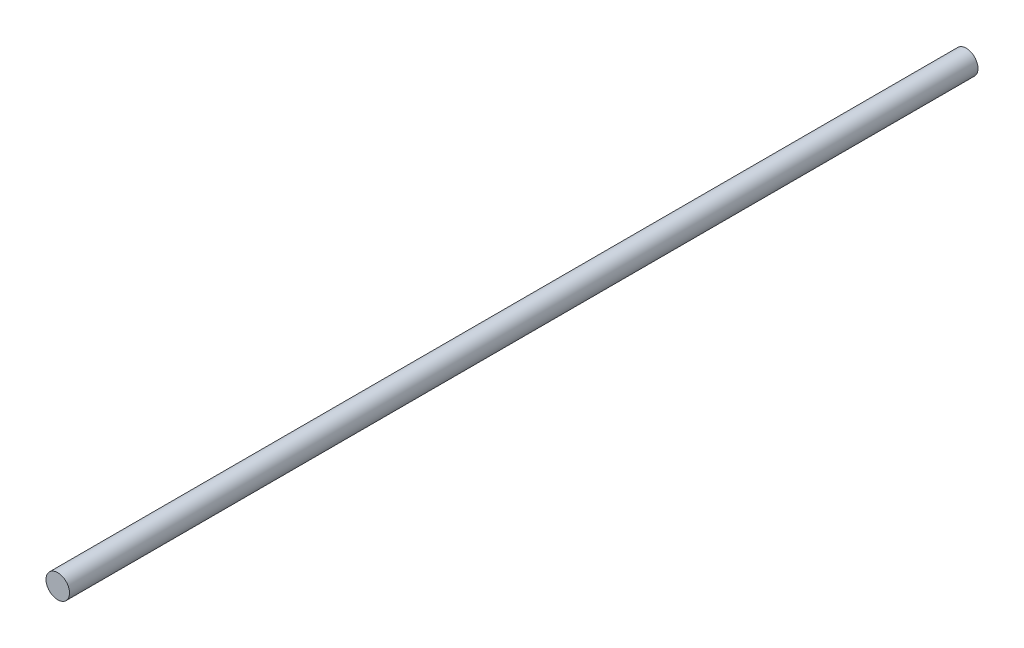
ISO-10303-21;
HEADER;
FILE_DESCRIPTION(('STEP AP214'),'2;1');
FILE_NAME('part.step','',(''),(''),'','','');
FILE_SCHEMA(('AUTOMOTIVE_DESIGN { 1 0 10303 214 1 1 1 1 }'));
ENDSEC;
DATA;
#1=APPLICATION_CONTEXT('core data for automotive mechanical design processes');
#2=APPLICATION_PROTOCOL_DEFINITION('international standard','automotive_design',2000,#1);
#3=PRODUCT_CONTEXT('',#1,'mechanical');
#4=PRODUCT('Part','Part','',(#3));
#5=PRODUCT_RELATED_PRODUCT_CATEGORY('part','',(#4));
#6=PRODUCT_DEFINITION_FORMATION('','',#4);
#7=PRODUCT_DEFINITION_CONTEXT('part definition',#1,'design');
#8=PRODUCT_DEFINITION('design','',#6,#7);
#9=PRODUCT_DEFINITION_SHAPE('','',#8);
#10=(LENGTH_UNIT() NAMED_UNIT(*) SI_UNIT(.MILLI.,.METRE.));
#11=(NAMED_UNIT(*) PLANE_ANGLE_UNIT() SI_UNIT($,.RADIAN.));
#12=(NAMED_UNIT(*) SI_UNIT($,.STERADIAN.) SOLID_ANGLE_UNIT());
#13=UNCERTAINTY_MEASURE_WITH_UNIT(LENGTH_MEASURE(1.E-05),#10,'distance_accuracy_value','');
#14=(GEOMETRIC_REPRESENTATION_CONTEXT(3) GLOBAL_UNCERTAINTY_ASSIGNED_CONTEXT((#13)) GLOBAL_UNIT_ASSIGNED_CONTEXT((#10,
#11,#12)) REPRESENTATION_CONTEXT('',''));
#15=CARTESIAN_POINT('',(0.,0.,0.));
#16=DIRECTION('',(0.,0.,1.));
#17=DIRECTION('',(1.,0.,0.));
#18=AXIS2_PLACEMENT_3D('',#15,#16,#17);
#19=CARTESIAN_POINT('',(0.,0.,245.));
#20=DIRECTION('',(0.,0.,-1.));
#21=DIRECTION('',(-1.,0.,0.));
#22=AXIS2_PLACEMENT_3D('',#19,#20,#21);
#23=CYLINDRICAL_SURFACE('',#22,3.175);
#24=CARTESIAN_POINT('',(0.,0.,245.));
#25=DIRECTION('',(0.,0.,1.));
#26=DIRECTION('',(1.,0.,0.));
#27=AXIS2_PLACEMENT_3D('',#24,#25,#26);
#28=CIRCLE('',#27,3.175);
#29=CARTESIAN_POINT('',(3.175,0.,245.));
#30=VERTEX_POINT('',#29);
#31=EDGE_CURVE('E10',#30,#30,#28,.T.);
#32=ORIENTED_EDGE('',*,*,#31,.F.);
#33=EDGE_LOOP('',(#32));
#34=FACE_BOUND('',#33,.T.);
#35=CARTESIAN_POINT('',(0.,0.,0.));
#36=DIRECTION('',(0.,0.,1.));
#37=DIRECTION('',(1.,0.,0.));
#38=AXIS2_PLACEMENT_3D('',#35,#36,#37);
#39=CIRCLE('',#38,3.175);
#40=CARTESIAN_POINT('',(3.175,0.,0.));
#41=VERTEX_POINT('',#40);
#42=EDGE_CURVE('E35',#41,#41,#39,.T.);
#43=ORIENTED_EDGE('',*,*,#42,.T.);
#44=EDGE_LOOP('',(#43));
#45=FACE_BOUND('',#44,.T.);
#46=ADVANCED_FACE('F32',(#34,#45),#23,.T.);
#47=CARTESIAN_POINT('',(0.,0.,245.));
#48=DIRECTION('',(0.,0.,1.));
#49=DIRECTION('',(1.,0.,0.));
#50=AXIS2_PLACEMENT_3D('',#47,#48,#49);
#51=PLANE('',#50);
#52=ORIENTED_EDGE('',*,*,#31,.T.);
#53=EDGE_LOOP('',(#52));
#54=FACE_BOUND('',#53,.T.);
#55=ADVANCED_FACE('F47',(#54),#51,.T.);
#56=CARTESIAN_POINT('',(0.,0.,0.));
#57=DIRECTION('',(0.,0.,1.));
#58=DIRECTION('',(1.,0.,0.));
#59=AXIS2_PLACEMENT_3D('',#56,#57,#58);
#60=PLANE('',#59);
#61=ORIENTED_EDGE('',*,*,#42,.F.);
#62=EDGE_LOOP('',(#61));
#63=FACE_BOUND('',#62,.T.);
#64=ADVANCED_FACE('F45',(#63),#60,.F.);
#65=CLOSED_SHELL('',(#46,#55,#64));
#66=MANIFOLD_SOLID_BREP('B2',#65);
#67=ADVANCED_BREP_SHAPE_REPRESENTATION('',(#18,#66),#14);
#68=SHAPE_DEFINITION_REPRESENTATION(#9,#67);
ENDSEC;
END-ISO-10303-21;
